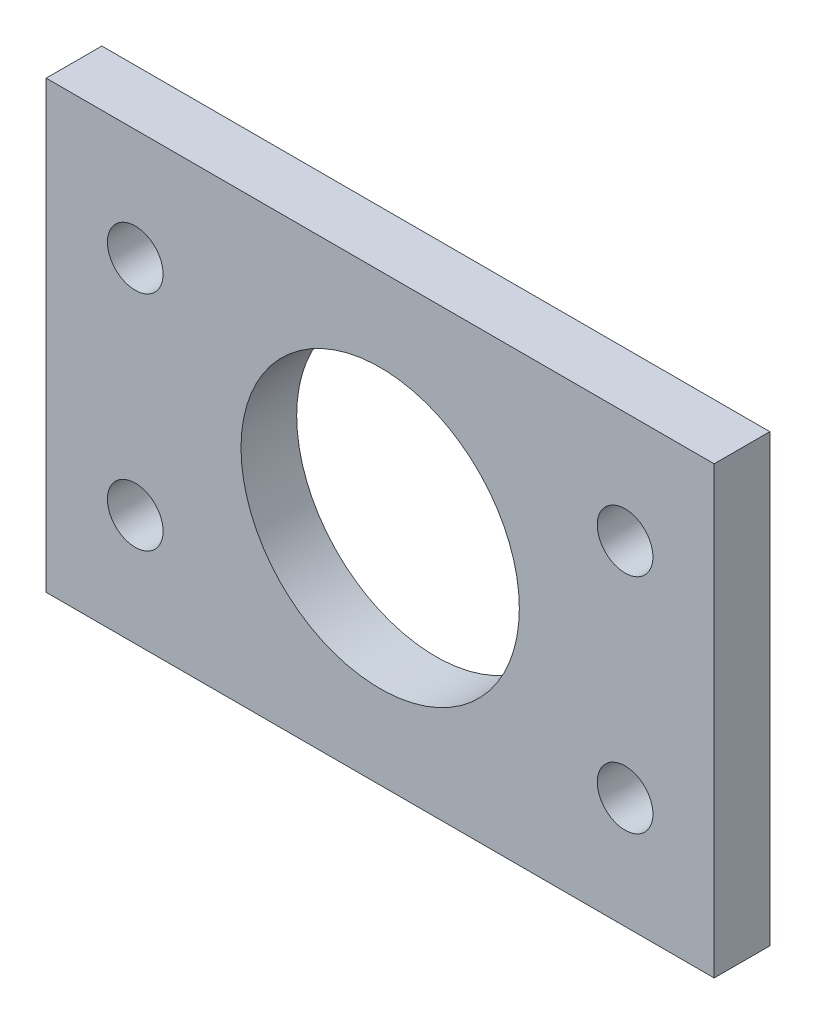
ISO-10303-21;
HEADER;
FILE_DESCRIPTION(('STEP AP214'),'2;1');
FILE_NAME('part.step','',(''),(''),'','','');
FILE_SCHEMA(('AUTOMOTIVE_DESIGN { 1 0 10303 214 1 1 1 1 }'));
ENDSEC;
DATA;
#1=APPLICATION_CONTEXT('core data for automotive mechanical design processes');
#2=APPLICATION_PROTOCOL_DEFINITION('international standard','automotive_design',2000,#1);
#3=PRODUCT_CONTEXT('',#1,'mechanical');
#4=PRODUCT('Part','Part','',(#3));
#5=PRODUCT_RELATED_PRODUCT_CATEGORY('part','',(#4));
#6=PRODUCT_DEFINITION_FORMATION('','',#4);
#7=PRODUCT_DEFINITION_CONTEXT('part definition',#1,'design');
#8=PRODUCT_DEFINITION('design','',#6,#7);
#9=PRODUCT_DEFINITION_SHAPE('','',#8);
#10=(LENGTH_UNIT() NAMED_UNIT(*) SI_UNIT(.MILLI.,.METRE.));
#11=(NAMED_UNIT(*) PLANE_ANGLE_UNIT() SI_UNIT($,.RADIAN.));
#12=(NAMED_UNIT(*) SI_UNIT($,.STERADIAN.) SOLID_ANGLE_UNIT());
#13=UNCERTAINTY_MEASURE_WITH_UNIT(LENGTH_MEASURE(1.E-05),#10,'distance_accuracy_value','');
#14=(GEOMETRIC_REPRESENTATION_CONTEXT(3) GLOBAL_UNCERTAINTY_ASSIGNED_CONTEXT((#13)) GLOBAL_UNIT_ASSIGNED_CONTEXT((#10,
#11,#12)) REPRESENTATION_CONTEXT('',''));
#15=CARTESIAN_POINT('',(0.,0.,0.));
#16=DIRECTION('',(0.,0.,1.));
#17=DIRECTION('',(1.,0.,0.));
#18=AXIS2_PLACEMENT_3D('',#15,#16,#17);
#19=CARTESIAN_POINT('',(0.,0.,5.));
#20=DIRECTION('',(1.,0.,0.));
#21=DIRECTION('',(0.,0.,-1.));
#22=AXIS2_PLACEMENT_3D('',#19,#20,#21);
#23=PLANE('',#22);
#24=DIRECTION('',(0.,-1.,0.));
#25=VECTOR('',#24,1.);
#26=CARTESIAN_POINT('',(0.,0.,0.));
#27=LINE('',#26,#25);
#28=CARTESIAN_POINT('',(0.,40.,0.));
#29=VERTEX_POINT('',#28);
#30=CARTESIAN_POINT('',(0.,0.,0.));
#31=VERTEX_POINT('',#30);
#32=EDGE_CURVE('E99',#29,#31,#27,.T.);
#33=ORIENTED_EDGE('',*,*,#32,.T.);
#34=DIRECTION('',(0.,0.,-1.));
#35=VECTOR('',#34,1.);
#36=CARTESIAN_POINT('',(0.,0.,5.));
#37=LINE('',#36,#35);
#38=CARTESIAN_POINT('',(0.,0.,5.));
#39=VERTEX_POINT('',#38);
#40=EDGE_CURVE('E11',#39,#31,#37,.T.);
#41=ORIENTED_EDGE('',*,*,#40,.F.);
#42=DIRECTION('',(0.,-1.,0.));
#43=VECTOR('',#42,1.);
#44=CARTESIAN_POINT('',(0.,0.,5.));
#45=LINE('',#44,#43);
#46=CARTESIAN_POINT('',(0.,40.,5.));
#47=VERTEX_POINT('',#46);
#48=EDGE_CURVE('E86',#47,#39,#45,.T.);
#49=ORIENTED_EDGE('',*,*,#48,.F.);
#50=DIRECTION('',(0.,0.,-1.));
#51=VECTOR('',#50,1.);
#52=CARTESIAN_POINT('',(0.,40.,5.));
#53=LINE('',#52,#51);
#54=EDGE_CURVE('E95',#47,#29,#53,.T.);
#55=ORIENTED_EDGE('',*,*,#54,.T.);
#56=EDGE_LOOP('',(#33,#41,#49,#55));
#57=FACE_BOUND('',#56,.T.);
#58=ADVANCED_FACE('F33',(#57),#23,.F.);
#59=CARTESIAN_POINT('',(0.,0.,5.));
#60=DIRECTION('',(0.,1.,0.));
#61=DIRECTION('',(0.,0.,1.));
#62=AXIS2_PLACEMENT_3D('',#59,#60,#61);
#63=PLANE('',#62);
#64=DIRECTION('',(1.,0.,0.));
#65=VECTOR('',#64,1.);
#66=CARTESIAN_POINT('',(0.,0.,0.));
#67=LINE('',#66,#65);
#68=CARTESIAN_POINT('',(60.,0.,0.));
#69=VERTEX_POINT('',#68);
#70=EDGE_CURVE('E90',#31,#69,#67,.T.);
#71=ORIENTED_EDGE('',*,*,#70,.T.);
#72=DIRECTION('',(0.,0.,-1.));
#73=VECTOR('',#72,1.);
#74=CARTESIAN_POINT('',(60.,0.,5.));
#75=LINE('',#74,#73);
#76=CARTESIAN_POINT('',(60.,0.,5.));
#77=VERTEX_POINT('',#76);
#78=EDGE_CURVE('E42',#77,#69,#75,.T.);
#79=ORIENTED_EDGE('',*,*,#78,.F.);
#80=DIRECTION('',(1.,0.,0.));
#81=VECTOR('',#80,1.);
#82=CARTESIAN_POINT('',(0.,0.,5.));
#83=LINE('',#82,#81);
#84=EDGE_CURVE('E81',#39,#77,#83,.T.);
#85=ORIENTED_EDGE('',*,*,#84,.F.);
#86=ORIENTED_EDGE('',*,*,#40,.T.);
#87=EDGE_LOOP('',(#71,#79,#85,#86));
#88=FACE_BOUND('',#87,.T.);
#89=ADVANCED_FACE('F89',(#88),#63,.F.);
#90=CARTESIAN_POINT('',(60.,0.,5.));
#91=DIRECTION('',(-1.,0.,0.));
#92=DIRECTION('',(0.,0.,1.));
#93=AXIS2_PLACEMENT_3D('',#90,#91,#92);
#94=PLANE('',#93);
#95=DIRECTION('',(0.,1.,0.));
#96=VECTOR('',#95,1.);
#97=CARTESIAN_POINT('',(60.,0.,0.));
#98=LINE('',#97,#96);
#99=CARTESIAN_POINT('',(60.,40.,0.));
#100=VERTEX_POINT('',#99);
#101=EDGE_CURVE('E68',#69,#100,#98,.T.);
#102=ORIENTED_EDGE('',*,*,#101,.T.);
#103=DIRECTION('',(0.,0.,-1.));
#104=VECTOR('',#103,1.);
#105=CARTESIAN_POINT('',(60.,40.,5.));
#106=LINE('',#105,#104);
#107=CARTESIAN_POINT('',(60.,40.,5.));
#108=VERTEX_POINT('',#107);
#109=EDGE_CURVE('E91',#108,#100,#106,.T.);
#110=ORIENTED_EDGE('',*,*,#109,.F.);
#111=DIRECTION('',(0.,1.,0.));
#112=VECTOR('',#111,1.);
#113=CARTESIAN_POINT('',(60.,0.,5.));
#114=LINE('',#113,#112);
#115=EDGE_CURVE('E84',#77,#108,#114,.T.);
#116=ORIENTED_EDGE('',*,*,#115,.F.);
#117=ORIENTED_EDGE('',*,*,#78,.T.);
#118=EDGE_LOOP('',(#102,#110,#116,#117));
#119=FACE_BOUND('',#118,.T.);
#120=ADVANCED_FACE('F93',(#119),#94,.F.);
#121=CARTESIAN_POINT('',(0.,40.,5.));
#122=DIRECTION('',(0.,-1.,0.));
#123=DIRECTION('',(0.,0.,-1.));
#124=AXIS2_PLACEMENT_3D('',#121,#122,#123);
#125=PLANE('',#124);
#126=DIRECTION('',(-1.,0.,0.));
#127=VECTOR('',#126,1.);
#128=CARTESIAN_POINT('',(0.,40.,0.));
#129=LINE('',#128,#127);
#130=EDGE_CURVE('E74',#100,#29,#129,.T.);
#131=ORIENTED_EDGE('',*,*,#130,.T.);
#132=ORIENTED_EDGE('',*,*,#54,.F.);
#133=DIRECTION('',(-1.,0.,0.));
#134=VECTOR('',#133,1.);
#135=CARTESIAN_POINT('',(0.,40.,5.));
#136=LINE('',#135,#134);
#137=EDGE_CURVE('E51',#108,#47,#136,.T.);
#138=ORIENTED_EDGE('',*,*,#137,.F.);
#139=ORIENTED_EDGE('',*,*,#109,.T.);
#140=EDGE_LOOP('',(#131,#132,#138,#139));
#141=FACE_BOUND('',#140,.T.);
#142=ADVANCED_FACE('F146',(#141),#125,.F.);
#143=CARTESIAN_POINT('',(0.,0.,5.));
#144=DIRECTION('',(0.,0.,-1.));
#145=DIRECTION('',(-1.,0.,0.));
#146=AXIS2_PLACEMENT_3D('',#143,#144,#145);
#147=PLANE('',#146);
#148=CARTESIAN_POINT('',(52.,30.,5.));
#149=DIRECTION('',(0.,0.,1.));
#150=DIRECTION('',(1.,0.,0.));
#151=AXIS2_PLACEMENT_3D('',#148,#149,#150);
#152=CIRCLE('',#151,2.5);
#153=CARTESIAN_POINT('',(54.5,30.,5.));
#154=VERTEX_POINT('',#153);
#155=EDGE_CURVE('E132',#154,#154,#152,.T.);
#156=ORIENTED_EDGE('',*,*,#155,.F.);
#157=EDGE_LOOP('',(#156));
#158=FACE_BOUND('',#157,.T.);
#159=CARTESIAN_POINT('',(52.,10.,5.));
#160=DIRECTION('',(0.,0.,1.));
#161=DIRECTION('',(1.,0.,0.));
#162=AXIS2_PLACEMENT_3D('',#159,#160,#161);
#163=CIRCLE('',#162,2.5);
#164=CARTESIAN_POINT('',(54.5,10.,5.));
#165=VERTEX_POINT('',#164);
#166=EDGE_CURVE('E135',#165,#165,#163,.T.);
#167=ORIENTED_EDGE('',*,*,#166,.F.);
#168=EDGE_LOOP('',(#167));
#169=FACE_BOUND('',#168,.T.);
#170=CARTESIAN_POINT('',(8.,10.,5.));
#171=DIRECTION('',(0.,0.,1.));
#172=DIRECTION('',(1.,0.,0.));
#173=AXIS2_PLACEMENT_3D('',#170,#171,#172);
#174=CIRCLE('',#173,2.5);
#175=CARTESIAN_POINT('',(10.5,10.,5.));
#176=VERTEX_POINT('',#175);
#177=EDGE_CURVE('E131',#176,#176,#174,.T.);
#178=ORIENTED_EDGE('',*,*,#177,.F.);
#179=EDGE_LOOP('',(#178));
#180=FACE_BOUND('',#179,.T.);
#181=CARTESIAN_POINT('',(8.,30.,5.));
#182=DIRECTION('',(0.,0.,1.));
#183=DIRECTION('',(1.,0.,0.));
#184=AXIS2_PLACEMENT_3D('',#181,#182,#183);
#185=CIRCLE('',#184,2.5);
#186=CARTESIAN_POINT('',(10.5,30.,5.));
#187=VERTEX_POINT('',#186);
#188=EDGE_CURVE('E112',#187,#187,#185,.T.);
#189=ORIENTED_EDGE('',*,*,#188,.F.);
#190=EDGE_LOOP('',(#189));
#191=FACE_BOUND('',#190,.T.);
#192=CARTESIAN_POINT('',(30.,20.,5.));
#193=DIRECTION('',(0.,0.,1.));
#194=DIRECTION('',(1.,0.,0.));
#195=AXIS2_PLACEMENT_3D('',#192,#193,#194);
#196=CIRCLE('',#195,12.5);
#197=CARTESIAN_POINT('',(42.5,20.,5.));
#198=VERTEX_POINT('',#197);
#199=EDGE_CURVE('E119',#198,#198,#196,.T.);
#200=ORIENTED_EDGE('',*,*,#199,.F.);
#201=EDGE_LOOP('',(#200));
#202=FACE_BOUND('',#201,.T.);
#203=ORIENTED_EDGE('',*,*,#48,.T.);
#204=ORIENTED_EDGE('',*,*,#84,.T.);
#205=ORIENTED_EDGE('',*,*,#115,.T.);
#206=ORIENTED_EDGE('',*,*,#137,.T.);
#207=EDGE_LOOP('',(#203,#204,#205,#206));
#208=FACE_BOUND('',#207,.T.);
#209=ADVANCED_FACE('F82',(#158,#169,#180,#191,#202,#208),#147,.F.);
#210=CARTESIAN_POINT('',(0.,0.,0.));
#211=DIRECTION('',(0.,0.,-1.));
#212=DIRECTION('',(-1.,0.,0.));
#213=AXIS2_PLACEMENT_3D('',#210,#211,#212);
#214=PLANE('',#213);
#215=CARTESIAN_POINT('',(52.,30.,0.));
#216=DIRECTION('',(0.,0.,-1.));
#217=DIRECTION('',(-1.,0.,0.));
#218=AXIS2_PLACEMENT_3D('',#215,#216,#217);
#219=CIRCLE('',#218,2.5);
#220=CARTESIAN_POINT('',(49.5,30.,0.));
#221=VERTEX_POINT('',#220);
#222=EDGE_CURVE('E36',#221,#221,#219,.T.);
#223=ORIENTED_EDGE('',*,*,#222,.F.);
#224=EDGE_LOOP('',(#223));
#225=FACE_BOUND('',#224,.T.);
#226=CARTESIAN_POINT('',(52.,10.,0.));
#227=DIRECTION('',(0.,0.,-1.));
#228=DIRECTION('',(-1.,0.,0.));
#229=AXIS2_PLACEMENT_3D('',#226,#227,#228);
#230=CIRCLE('',#229,2.5);
#231=CARTESIAN_POINT('',(49.5,10.,0.));
#232=VERTEX_POINT('',#231);
#233=EDGE_CURVE('E114',#232,#232,#230,.T.);
#234=ORIENTED_EDGE('',*,*,#233,.F.);
#235=EDGE_LOOP('',(#234));
#236=FACE_BOUND('',#235,.T.);
#237=CARTESIAN_POINT('',(8.,10.,0.));
#238=DIRECTION('',(0.,0.,-1.));
#239=DIRECTION('',(-1.,0.,0.));
#240=AXIS2_PLACEMENT_3D('',#237,#238,#239);
#241=CIRCLE('',#240,2.5);
#242=CARTESIAN_POINT('',(5.5,10.,0.));
#243=VERTEX_POINT('',#242);
#244=EDGE_CURVE('E111',#243,#243,#241,.T.);
#245=ORIENTED_EDGE('',*,*,#244,.F.);
#246=EDGE_LOOP('',(#245));
#247=FACE_BOUND('',#246,.T.);
#248=CARTESIAN_POINT('',(8.,30.,0.));
#249=DIRECTION('',(0.,0.,-1.));
#250=DIRECTION('',(-1.,0.,0.));
#251=AXIS2_PLACEMENT_3D('',#248,#249,#250);
#252=CIRCLE('',#251,2.5);
#253=CARTESIAN_POINT('',(5.5,30.,0.));
#254=VERTEX_POINT('',#253);
#255=EDGE_CURVE('E108',#254,#254,#252,.T.);
#256=ORIENTED_EDGE('',*,*,#255,.F.);
#257=EDGE_LOOP('',(#256));
#258=FACE_BOUND('',#257,.T.);
#259=CARTESIAN_POINT('',(30.,20.,0.));
#260=DIRECTION('',(0.,0.,1.));
#261=DIRECTION('',(1.,0.,0.));
#262=AXIS2_PLACEMENT_3D('',#259,#260,#261);
#263=CIRCLE('',#262,12.5);
#264=CARTESIAN_POINT('',(42.5,20.,0.));
#265=VERTEX_POINT('',#264);
#266=EDGE_CURVE('E102',#265,#265,#263,.T.);
#267=ORIENTED_EDGE('',*,*,#266,.T.);
#268=EDGE_LOOP('',(#267));
#269=FACE_BOUND('',#268,.T.);
#270=ORIENTED_EDGE('',*,*,#32,.F.);
#271=ORIENTED_EDGE('',*,*,#130,.F.);
#272=ORIENTED_EDGE('',*,*,#101,.F.);
#273=ORIENTED_EDGE('',*,*,#70,.F.);
#274=EDGE_LOOP('',(#270,#271,#272,#273));
#275=FACE_BOUND('',#274,.T.);
#276=ADVANCED_FACE('F145',(#225,#236,#247,#258,#269,#275),#214,.T.);
#277=CARTESIAN_POINT('',(30.,20.,0.));
#278=DIRECTION('',(0.,0.,1.));
#279=DIRECTION('',(1.,0.,0.));
#280=AXIS2_PLACEMENT_3D('',#277,#278,#279);
#281=CYLINDRICAL_SURFACE('',#280,12.5);
#282=ORIENTED_EDGE('',*,*,#266,.F.);
#283=EDGE_LOOP('',(#282));
#284=FACE_BOUND('',#283,.T.);
#285=ORIENTED_EDGE('',*,*,#199,.T.);
#286=EDGE_LOOP('',(#285));
#287=FACE_BOUND('',#286,.T.);
#288=ADVANCED_FACE('F154',(#284,#287),#281,.F.);
#289=CARTESIAN_POINT('',(8.,30.,-5.));
#290=DIRECTION('',(0.,0.,1.));
#291=DIRECTION('',(1.,0.,0.));
#292=AXIS2_PLACEMENT_3D('',#289,#290,#291);
#293=CYLINDRICAL_SURFACE('',#292,2.5);
#294=ORIENTED_EDGE('',*,*,#255,.T.);
#295=EDGE_LOOP('',(#294));
#296=FACE_BOUND('',#295,.T.);
#297=ORIENTED_EDGE('',*,*,#188,.T.);
#298=EDGE_LOOP('',(#297));
#299=FACE_BOUND('',#298,.T.);
#300=ADVANCED_FACE('F152',(#296,#299),#293,.F.);
#301=CARTESIAN_POINT('',(8.,10.,-5.));
#302=DIRECTION('',(0.,0.,1.));
#303=DIRECTION('',(1.,0.,0.));
#304=AXIS2_PLACEMENT_3D('',#301,#302,#303);
#305=CYLINDRICAL_SURFACE('',#304,2.5);
#306=ORIENTED_EDGE('',*,*,#244,.T.);
#307=EDGE_LOOP('',(#306));
#308=FACE_BOUND('',#307,.T.);
#309=ORIENTED_EDGE('',*,*,#177,.T.);
#310=EDGE_LOOP('',(#309));
#311=FACE_BOUND('',#310,.T.);
#312=ADVANCED_FACE('F141',(#308,#311),#305,.F.);
#313=CARTESIAN_POINT('',(52.,10.,-5.));
#314=DIRECTION('',(0.,0.,1.));
#315=DIRECTION('',(1.,0.,0.));
#316=AXIS2_PLACEMENT_3D('',#313,#314,#315);
#317=CYLINDRICAL_SURFACE('',#316,2.5);
#318=ORIENTED_EDGE('',*,*,#233,.T.);
#319=EDGE_LOOP('',(#318));
#320=FACE_BOUND('',#319,.T.);
#321=ORIENTED_EDGE('',*,*,#166,.T.);
#322=EDGE_LOOP('',(#321));
#323=FACE_BOUND('',#322,.T.);
#324=ADVANCED_FACE('F161',(#320,#323),#317,.F.);
#325=CARTESIAN_POINT('',(52.,30.,-5.));
#326=DIRECTION('',(0.,0.,1.));
#327=DIRECTION('',(1.,0.,0.));
#328=AXIS2_PLACEMENT_3D('',#325,#326,#327);
#329=CYLINDRICAL_SURFACE('',#328,2.5);
#330=ORIENTED_EDGE('',*,*,#222,.T.);
#331=EDGE_LOOP('',(#330));
#332=FACE_BOUND('',#331,.T.);
#333=ORIENTED_EDGE('',*,*,#155,.T.);
#334=EDGE_LOOP('',(#333));
#335=FACE_BOUND('',#334,.T.);
#336=ADVANCED_FACE('F225',(#332,#335),#329,.F.);
#337=CLOSED_SHELL('',(#58,#89,#120,#142,#209,#276,#288,#300,#312,#324,#336));
#338=MANIFOLD_SOLID_BREP('B2',#337);
#339=ADVANCED_BREP_SHAPE_REPRESENTATION('',(#18,#338),#14);
#340=SHAPE_DEFINITION_REPRESENTATION(#9,#339);
ENDSEC;
END-ISO-10303-21;
